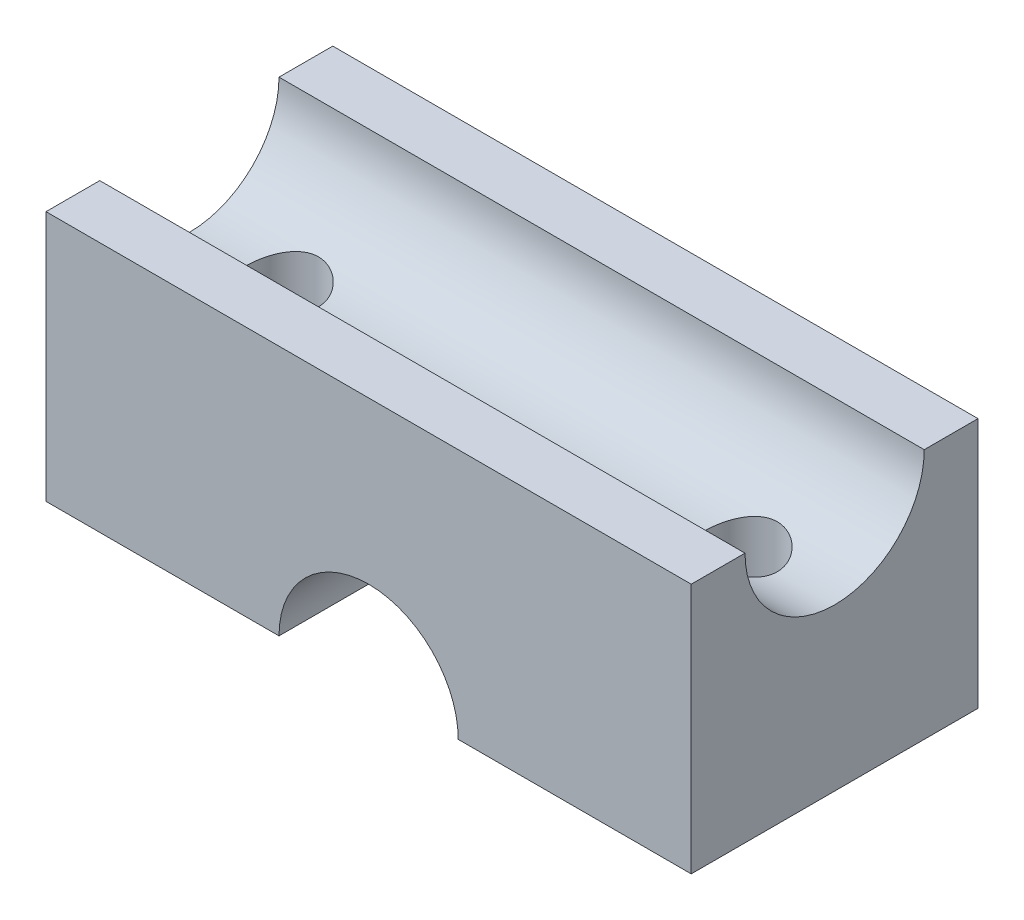
ISO-10303-21;
HEADER;
FILE_DESCRIPTION(('STEP AP214'),'2;1');
FILE_NAME('part.step','',(''),(''),'','','');
FILE_SCHEMA(('AUTOMOTIVE_DESIGN { 1 0 10303 214 1 1 1 1 }'));
ENDSEC;
DATA;
#1=APPLICATION_CONTEXT('core data for automotive mechanical design processes');
#2=APPLICATION_PROTOCOL_DEFINITION('international standard','automotive_design',2000,#1);
#3=PRODUCT_CONTEXT('',#1,'mechanical');
#4=PRODUCT('Part','Part','',(#3));
#5=PRODUCT_RELATED_PRODUCT_CATEGORY('part','',(#4));
#6=PRODUCT_DEFINITION_FORMATION('','',#4);
#7=PRODUCT_DEFINITION_CONTEXT('part definition',#1,'design');
#8=PRODUCT_DEFINITION('design','',#6,#7);
#9=PRODUCT_DEFINITION_SHAPE('','',#8);
#10=(LENGTH_UNIT() NAMED_UNIT(*) SI_UNIT(.MILLI.,.METRE.));
#11=(NAMED_UNIT(*) PLANE_ANGLE_UNIT() SI_UNIT($,.RADIAN.));
#12=(NAMED_UNIT(*) SI_UNIT($,.STERADIAN.) SOLID_ANGLE_UNIT());
#13=UNCERTAINTY_MEASURE_WITH_UNIT(LENGTH_MEASURE(1.E-05),#10,'distance_accuracy_value','');
#14=(GEOMETRIC_REPRESENTATION_CONTEXT(3) GLOBAL_UNCERTAINTY_ASSIGNED_CONTEXT((#13)) GLOBAL_UNIT_ASSIGNED_CONTEXT((#10,
#11,#12)) REPRESENTATION_CONTEXT('',''));
#15=CARTESIAN_POINT('',(0.,0.,0.));
#16=DIRECTION('',(0.,0.,1.));
#17=DIRECTION('',(1.,0.,0.));
#18=AXIS2_PLACEMENT_3D('',#15,#16,#17);
#19=CARTESIAN_POINT('',(45.,0.,20.));
#20=DIRECTION('',(0.,1.,0.));
#21=DIRECTION('',(0.,0.,1.));
#22=AXIS2_PLACEMENT_3D('',#19,#20,#21);
#23=PLANE('',#22);
#24=CARTESIAN_POINT('',(-32.,0.,0.));
#25=DIRECTION('',(0.,-1.,0.));
#26=DIRECTION('',(0.,0.,1.));
#27=AXIS2_PLACEMENT_3D('',#24,#25,#26);
#28=CIRCLE('',#27,5.);
#29=CARTESIAN_POINT('',(-32.,0.,5.));
#30=VERTEX_POINT('',#29);
#31=EDGE_CURVE('E177',#30,#30,#28,.T.);
#32=ORIENTED_EDGE('',*,*,#31,.F.);
#33=EDGE_LOOP('',(#32));
#34=FACE_BOUND('',#33,.T.);
#35=DIRECTION('',(0.,0.,1.));
#36=VECTOR('',#35,1.);
#37=CARTESIAN_POINT('',(-12.5,0.,-20.001));
#38=LINE('',#37,#36);
#39=CARTESIAN_POINT('',(-12.5,0.,20.));
#40=VERTEX_POINT('',#39);
#41=CARTESIAN_POINT('',(-12.5,0.,-20.));
#42=VERTEX_POINT('',#41);
#43=EDGE_CURVE('E53',#40,#42,#38,.F.);
#44=ORIENTED_EDGE('',*,*,#43,.F.);
#45=DIRECTION('',(-1.,0.,0.));
#46=VECTOR('',#45,1.);
#47=CARTESIAN_POINT('',(45.,0.,20.));
#48=LINE('',#47,#46);
#49=CARTESIAN_POINT('',(-45.,0.,20.));
#50=VERTEX_POINT('',#49);
#51=EDGE_CURVE('E50',#40,#50,#48,.T.);
#52=ORIENTED_EDGE('',*,*,#51,.T.);
#53=DIRECTION('',(0.,0.,-1.));
#54=VECTOR('',#53,1.);
#55=CARTESIAN_POINT('',(-45.,0.,20.));
#56=LINE('',#55,#54);
#57=CARTESIAN_POINT('',(-45.,0.,-20.));
#58=VERTEX_POINT('',#57);
#59=EDGE_CURVE('E140',#50,#58,#56,.T.);
#60=ORIENTED_EDGE('',*,*,#59,.T.);
#61=DIRECTION('',(-1.,0.,0.));
#62=VECTOR('',#61,1.);
#63=CARTESIAN_POINT('',(45.,0.,-20.));
#64=LINE('',#63,#62);
#65=EDGE_CURVE('E151',#42,#58,#64,.T.);
#66=ORIENTED_EDGE('',*,*,#65,.F.);
#67=EDGE_LOOP('',(#44,#52,#60,#66));
#68=FACE_BOUND('',#67,.T.);
#69=ADVANCED_FACE('F39',(#34,#68),#23,.F.);
#70=CARTESIAN_POINT('',(32.,0.,0.));
#71=DIRECTION('',(0.,-1.,0.));
#72=DIRECTION('',(0.,0.,-1.));
#73=AXIS2_PLACEMENT_3D('',#70,#71,#72);
#74=CIRCLE('',#73,5.);
#75=CARTESIAN_POINT('',(32.,0.,-5.));
#76=VERTEX_POINT('',#75);
#77=EDGE_CURVE('E181',#76,#76,#74,.T.);
#78=ORIENTED_EDGE('',*,*,#77,.F.);
#79=EDGE_LOOP('',(#78));
#80=FACE_BOUND('',#79,.T.);
#81=DIRECTION('',(0.,0.,1.));
#82=VECTOR('',#81,1.);
#83=CARTESIAN_POINT('',(12.5,0.,-20.001));
#84=LINE('',#83,#82);
#85=CARTESIAN_POINT('',(12.5,0.,-20.));
#86=VERTEX_POINT('',#85);
#87=CARTESIAN_POINT('',(12.5,0.,20.));
#88=VERTEX_POINT('',#87);
#89=EDGE_CURVE('E179',#86,#88,#84,.T.);
#90=ORIENTED_EDGE('',*,*,#89,.F.);
#91=CARTESIAN_POINT('',(45.,0.,-20.));
#92=VERTEX_POINT('',#91);
#93=EDGE_CURVE('E155',#92,#86,#64,.T.);
#94=ORIENTED_EDGE('',*,*,#93,.F.);
#95=DIRECTION('',(0.,0.,-1.));
#96=VECTOR('',#95,1.);
#97=CARTESIAN_POINT('',(45.,0.,20.));
#98=LINE('',#97,#96);
#99=CARTESIAN_POINT('',(45.,0.,20.));
#100=VERTEX_POINT('',#99);
#101=EDGE_CURVE('E98',#100,#92,#98,.T.);
#102=ORIENTED_EDGE('',*,*,#101,.F.);
#103=EDGE_CURVE('E11',#100,#88,#48,.T.);
#104=ORIENTED_EDGE('',*,*,#103,.T.);
#105=EDGE_LOOP('',(#90,#94,#102,#104));
#106=FACE_BOUND('',#105,.T.);
#107=ADVANCED_FACE('F217',(#80,#106),#23,.F.);
#108=CARTESIAN_POINT('',(45.,0.,20.));
#109=DIRECTION('',(0.,0.,-1.));
#110=DIRECTION('',(0.,1.,0.));
#111=AXIS2_PLACEMENT_3D('',#108,#109,#110);
#112=PLANE('',#111);
#113=CARTESIAN_POINT('',(0.,0.,20.));
#114=DIRECTION('',(0.,0.,1.));
#115=DIRECTION('',(1.,0.,0.));
#116=AXIS2_PLACEMENT_3D('',#113,#114,#115);
#117=CIRCLE('',#116,12.5);
#118=EDGE_CURVE('E174',#88,#40,#117,.T.);
#119=ORIENTED_EDGE('',*,*,#118,.F.);
#120=ORIENTED_EDGE('',*,*,#103,.F.);
#121=DIRECTION('',(0.,-1.,0.));
#122=VECTOR('',#121,1.);
#123=CARTESIAN_POINT('',(45.,0.,20.));
#124=LINE('',#123,#122);
#125=CARTESIAN_POINT('',(45.,35.,20.));
#126=VERTEX_POINT('',#125);
#127=EDGE_CURVE('E146',#126,#100,#124,.T.);
#128=ORIENTED_EDGE('',*,*,#127,.F.);
#129=DIRECTION('',(-1.,0.,0.));
#130=VECTOR('',#129,1.);
#131=CARTESIAN_POINT('',(45.,35.,20.));
#132=LINE('',#131,#130);
#133=CARTESIAN_POINT('',(-45.,35.,20.));
#134=VERTEX_POINT('',#133);
#135=EDGE_CURVE('E132',#126,#134,#132,.T.);
#136=ORIENTED_EDGE('',*,*,#135,.T.);
#137=DIRECTION('',(0.,-1.,0.));
#138=VECTOR('',#137,1.);
#139=CARTESIAN_POINT('',(-45.,0.,20.));
#140=LINE('',#139,#138);
#141=EDGE_CURVE('E133',#134,#50,#140,.T.);
#142=ORIENTED_EDGE('',*,*,#141,.T.);
#143=ORIENTED_EDGE('',*,*,#51,.F.);
#144=EDGE_LOOP('',(#119,#120,#128,#136,#142,#143));
#145=FACE_BOUND('',#144,.T.);
#146=ADVANCED_FACE('F41',(#145),#112,.F.);
#147=CARTESIAN_POINT('',(45.,0.,-20.));
#148=DIRECTION('',(0.,0.,1.));
#149=DIRECTION('',(0.,-1.,0.));
#150=AXIS2_PLACEMENT_3D('',#147,#148,#149);
#151=PLANE('',#150);
#152=CARTESIAN_POINT('',(0.,0.,-20.));
#153=DIRECTION('',(0.,0.,1.));
#154=DIRECTION('',(0.,-1.,0.));
#155=AXIS2_PLACEMENT_3D('',#152,#153,#154);
#156=CIRCLE('',#155,12.5);
#157=EDGE_CURVE('E138',#42,#86,#156,.F.);
#158=ORIENTED_EDGE('',*,*,#157,.F.);
#159=ORIENTED_EDGE('',*,*,#65,.T.);
#160=DIRECTION('',(0.,1.,0.));
#161=VECTOR('',#160,1.);
#162=CARTESIAN_POINT('',(-45.,0.,-20.));
#163=LINE('',#162,#161);
#164=CARTESIAN_POINT('',(-45.,35.,-20.));
#165=VERTEX_POINT('',#164);
#166=EDGE_CURVE('E142',#58,#165,#163,.T.);
#167=ORIENTED_EDGE('',*,*,#166,.T.);
#168=DIRECTION('',(-1.,0.,0.));
#169=VECTOR('',#168,1.);
#170=CARTESIAN_POINT('',(45.,35.,-20.));
#171=LINE('',#170,#169);
#172=CARTESIAN_POINT('',(45.,35.,-20.));
#173=VERTEX_POINT('',#172);
#174=EDGE_CURVE('E127',#173,#165,#171,.T.);
#175=ORIENTED_EDGE('',*,*,#174,.F.);
#176=DIRECTION('',(0.,1.,0.));
#177=VECTOR('',#176,1.);
#178=CARTESIAN_POINT('',(45.,0.,-20.));
#179=LINE('',#178,#177);
#180=EDGE_CURVE('E111',#92,#173,#179,.T.);
#181=ORIENTED_EDGE('',*,*,#180,.F.);
#182=ORIENTED_EDGE('',*,*,#93,.T.);
#183=EDGE_LOOP('',(#158,#159,#167,#175,#181,#182));
#184=FACE_BOUND('',#183,.T.);
#185=ADVANCED_FACE('F156',(#184),#151,.F.);
#186=CARTESIAN_POINT('',(45.,35.,-12.5));
#187=DIRECTION('',(0.,-1.,0.));
#188=DIRECTION('',(0.,0.,-1.));
#189=AXIS2_PLACEMENT_3D('',#186,#187,#188);
#190=PLANE('',#189);
#191=DIRECTION('',(0.,0.,1.));
#192=VECTOR('',#191,1.);
#193=CARTESIAN_POINT('',(-45.,35.,-12.5));
#194=LINE('',#193,#192);
#195=CARTESIAN_POINT('',(-45.,35.,-12.5));
#196=VERTEX_POINT('',#195);
#197=EDGE_CURVE('E125',#165,#196,#194,.T.);
#198=ORIENTED_EDGE('',*,*,#197,.T.);
#199=DIRECTION('',(-1.,0.,0.));
#200=VECTOR('',#199,1.);
#201=CARTESIAN_POINT('',(45.,35.,-12.5));
#202=LINE('',#201,#200);
#203=CARTESIAN_POINT('',(45.,35.,-12.5));
#204=VERTEX_POINT('',#203);
#205=EDGE_CURVE('E118',#204,#196,#202,.T.);
#206=ORIENTED_EDGE('',*,*,#205,.F.);
#207=DIRECTION('',(0.,0.,1.));
#208=VECTOR('',#207,1.);
#209=CARTESIAN_POINT('',(45.,35.,-12.5));
#210=LINE('',#209,#208);
#211=EDGE_CURVE('E110',#173,#204,#210,.T.);
#212=ORIENTED_EDGE('',*,*,#211,.F.);
#213=ORIENTED_EDGE('',*,*,#174,.T.);
#214=EDGE_LOOP('',(#198,#206,#212,#213));
#215=FACE_BOUND('',#214,.T.);
#216=ADVANCED_FACE('F124',(#215),#190,.F.);
#217=CARTESIAN_POINT('',(45.,35.,0.));
#218=DIRECTION('',(-1.,0.,0.));
#219=DIRECTION('',(0.,0.,1.));
#220=AXIS2_PLACEMENT_3D('',#217,#218,#219);
#221=CYLINDRICAL_SURFACE('',#220,12.5);
#222=CARTESIAN_POINT('',(32.,23.5435607626104,-4.99999999999999));
#223=CARTESIAN_POINT('',(31.8660283447571,23.5435597282972,-4.99999896345635));
#224=CARTESIAN_POINT('',(31.7320157412703,23.541202866164,-4.99460812226168));
#225=CARTESIAN_POINT('',(31.4649593159264,23.531851217671,-4.97309727860773));
#226=CARTESIAN_POINT('',(31.3319161374354,23.524853592646,-4.95697070928759));
#227=CARTESIAN_POINT('',(31.0675821130226,23.506437131682,-4.91411809632373));
#228=CARTESIAN_POINT('',(30.9362953014132,23.4950094861683,-4.88737092988402));
#229=CARTESIAN_POINT('',(30.6766328447658,23.4681046124875,-4.82354498839358));
#230=CARTESIAN_POINT('',(30.5482584323957,23.4526257031396,-4.78646192376798));
#231=CARTESIAN_POINT('',(30.2958467735072,23.418179074227,-4.70249631279828));
#232=CARTESIAN_POINT('',(30.1717935213556,23.3992263407905,-4.65565574627602));
#233=CARTESIAN_POINT('',(29.9281880184655,23.3583524434179,-4.55248500137673));
#234=CARTESIAN_POINT('',(29.8086374787532,23.3364301653167,-4.49615125924047));
#235=CARTESIAN_POINT('',(29.4579270960664,23.2671507036288,-4.3136049615171));
#236=CARTESIAN_POINT('',(29.2343936453876,23.2162354581091,-4.17374176623427));
#237=CARTESIAN_POINT('',(28.8018142111573,23.1074749754673,-3.85329894815133));
#238=CARTESIAN_POINT('',(28.5941207934567,23.0494072807794,-3.67098388496262));
#239=CARTESIAN_POINT('',(28.211165651799,22.9346833439582,-3.27423726141593));
#240=CARTESIAN_POINT('',(28.0359152613584,22.8780276010292,-3.05979452486022));
#241=CARTESIAN_POINT('',(27.7978552144935,22.797452502331,-2.71343446709669));
#242=CARTESIAN_POINT('',(27.7214339497963,22.7708662764241,-2.5912733099283));
#243=CARTESIAN_POINT('',(27.5792226804951,22.720388854284,-2.34040236484103));
#244=CARTESIAN_POINT('',(27.5134282949656,22.6964965487163,-2.21169530438851));
#245=CARTESIAN_POINT('',(27.3930458325952,22.6520894389729,-1.94856757348531));
#246=CARTESIAN_POINT('',(27.3384590864486,22.6315750359161,-1.81414622685607));
#247=CARTESIAN_POINT('',(27.2410603355298,22.5945384235569,-1.54063330241623));
#248=CARTESIAN_POINT('',(27.1982425867934,22.578014267259,-1.40154404015104));
#249=CARTESIAN_POINT('',(27.1265801700171,22.5501331285953,-1.12649748730775));
#250=CARTESIAN_POINT('',(27.0971633612554,22.5385661626969,-0.990710411787391));
#251=CARTESIAN_POINT('',(27.0497150885416,22.5198219350164,-0.716918272307652));
#252=CARTESIAN_POINT('',(27.0316786422134,22.5126427522854,-0.578914206131956));
#253=CARTESIAN_POINT('',(27.0071741086334,22.5028729720003,-0.301736395081969));
#254=CARTESIAN_POINT('',(27.000704705593,22.5002818525395,-0.162562785056849));
#255=CARTESIAN_POINT('',(26.9994044220967,22.4997617983353,0.115845101070381));
#256=CARTESIAN_POINT('',(27.004573132475,22.5018326996874,0.255079374867643));
#257=CARTESIAN_POINT('',(27.0258690983752,22.5103286287078,0.524650869352976));
#258=CARTESIAN_POINT('',(27.0413614909945,22.5165013532998,0.65504677297613));
#259=CARTESIAN_POINT('',(27.0825039320662,22.5327865490012,0.914018496973082));
#260=CARTESIAN_POINT('',(27.1081573562362,22.5429003293977,1.04259369775127));
#261=CARTESIAN_POINT('',(27.1693722183383,22.5668117819479,1.29697225214547));
#262=CARTESIAN_POINT('',(27.2049303985908,22.5806082428039,1.42277650247331));
#263=CARTESIAN_POINT('',(27.2856332827261,22.6115426140623,1.67086551320144));
#264=CARTESIAN_POINT('',(27.3307816274306,22.6286817932958,1.7931489168656));
#265=CARTESIAN_POINT('',(27.4815462448966,22.6850675674925,2.15709786014183));
#266=CARTESIAN_POINT('',(27.6016096016308,22.7289274053183,2.39225334748552));
#267=CARTESIAN_POINT('',(27.8761772077449,22.8246389547488,2.83956110178507));
#268=CARTESIAN_POINT('',(28.0306932614583,22.8764934036187,3.05170544744262));
#269=CARTESIAN_POINT('',(28.3816081565145,22.9869563954866,3.46190518931431));
#270=CARTESIAN_POINT('',(28.5800907527545,23.0457848558498,3.65812112197786));
#271=CARTESIAN_POINT('',(29.0075204226263,23.1609654593056,4.01529203734466));
#272=CARTESIAN_POINT('',(29.2364774284798,23.2173167870516,4.17623547858126));
#273=CARTESIAN_POINT('',(29.6019725905173,23.2959078698718,4.38978443246195));
#274=CARTESIAN_POINT('',(29.7294421756794,23.3214309007868,4.45706290689687));
#275=CARTESIAN_POINT('',(29.990188779216,23.3693100131468,4.58054965734117));
#276=CARTESIAN_POINT('',(30.1234634133913,23.3916673790243,4.63676242676806));
#277=CARTESIAN_POINT('',(30.3948711331214,23.4324400959905,4.73756451801146));
#278=CARTESIAN_POINT('',(30.5330026690723,23.4508566913382,4.78215750962756));
#279=CARTESIAN_POINT('',(30.813124013641,23.4830850501522,4.8592612872628));
#280=CARTESIAN_POINT('',(30.9551135106747,23.4968971843046,4.89177304591582));
#281=CARTESIAN_POINT('',(31.2330205622847,23.5186997901185,4.94271833591523));
#282=CARTESIAN_POINT('',(31.3687791615958,23.5269943556979,4.96189056112493));
#283=CARTESIAN_POINT('',(31.6416170735738,23.5387667072066,4.98902318531047));
#284=CARTESIAN_POINT('',(31.7786963074636,23.5422447786741,4.9969842489227));
#285=CARTESIAN_POINT('',(32.0530459962113,23.5442589658173,5.00160011831507));
#286=CARTESIAN_POINT('',(32.1903163932562,23.5427963440774,4.99825781264842));
#287=CARTESIAN_POINT('',(32.4639741829388,23.534985260619,4.9803144219869));
#288=CARTESIAN_POINT('',(32.6003615977501,23.5286369220757,4.96571362083305));
#289=CARTESIAN_POINT('',(32.8634312022493,23.5117762079951,4.9265749164465));
#290=CARTESIAN_POINT('',(32.9902220519028,23.5015229858773,4.90265366107081));
#291=CARTESIAN_POINT('',(33.2412438186927,23.4771946886017,4.8451953366982));
#292=CARTESIAN_POINT('',(33.3654738932115,23.4631183763996,4.81165515509086));
#293=CARTESIAN_POINT('',(33.7330822513964,23.4157545934881,4.69704010843111));
#294=CARTESIAN_POINT('',(33.9715824009333,23.3773182028339,4.60193998403524));
#295=CARTESIAN_POINT('',(34.4390467693337,23.2891533567317,4.37282827873934));
#296=CARTESIAN_POINT('',(34.6672320431578,23.2390301817487,4.23739510722871));
#297=CARTESIAN_POINT('',(35.0986908904228,23.1337425742253,3.93292512945836));
#298=CARTESIAN_POINT('',(35.3019542639372,23.0785760936003,3.76387463817205));
#299=CARTESIAN_POINT('',(35.6934608170582,22.9644698886347,3.38207030815392));
#300=CARTESIAN_POINT('',(35.8794855101171,22.9055524447724,3.16701066461656));
#301=CARTESIAN_POINT('',(36.1296007300178,22.8222565520902,2.8225211988967));
#302=CARTESIAN_POINT('',(36.2081897837919,22.7953236540126,2.70396535427571));
#303=CARTESIAN_POINT('',(36.3551743297635,22.7438667734304,2.46021851983988));
#304=CARTESIAN_POINT('',(36.4235742026212,22.7193417572543,2.33503041301595));
#305=CARTESIAN_POINT('',(36.549625993472,22.6733763579408,2.07877500253335));
#306=CARTESIAN_POINT('',(36.6072751087603,22.6519367795036,1.94770617679832));
#307=CARTESIAN_POINT('',(36.7112484341921,22.6127669614713,1.68067073132675));
#308=CARTESIAN_POINT('',(36.7575774622826,22.5950351442793,1.5447062236131));
#309=CARTESIAN_POINT('',(36.8384514406103,22.5637939747987,1.26887322258795));
#310=CARTESIAN_POINT('',(36.8729990967598,22.5502836529886,1.12900563371975));
#311=CARTESIAN_POINT('',(36.9299369384677,22.5278874632576,0.846455094767155));
#312=CARTESIAN_POINT('',(36.9523279459485,22.5190012826958,0.703772335695227));
#313=CARTESIAN_POINT('',(36.9836307849264,22.5065462788594,0.426189188874798));
#314=CARTESIAN_POINT('',(36.9933290978161,22.5026674271553,0.291390847308921));
#315=CARTESIAN_POINT('',(37.0017794297219,22.4992887598456,0.0213478994604192));
#316=CARTESIAN_POINT('',(37.0005277609661,22.4997904195234,-0.113896841832118));
#317=CARTESIAN_POINT('',(36.9870853137872,22.505161772332,-0.383682371685984));
#318=CARTESIAN_POINT('',(36.9749002097683,22.5100291996485,-0.518223488997534));
#319=CARTESIAN_POINT('',(36.9397231134616,22.5239988456623,-0.785710697483681));
#320=CARTESIAN_POINT('',(36.9167270918159,22.5331026432925,-0.918656174981795));
#321=CARTESIAN_POINT('',(36.8610407550843,22.5549575790971,-1.17783467109344));
#322=CARTESIAN_POINT('',(36.8286748940186,22.5675862071708,-1.30414775975408));
#323=CARTESIAN_POINT('',(36.7543161133706,22.5962764793008,-1.55352320958305));
#324=CARTESIAN_POINT('',(36.7123198178389,22.6123393270891,-1.6765844138923));
#325=CARTESIAN_POINT('',(36.5724070907497,22.6651163167564,-2.03966746176945));
#326=CARTESIAN_POINT('',(36.4605203244963,22.7064379121275,-2.27380285420271));
#327=CARTESIAN_POINT('',(36.1972279703312,22.7995509357034,-2.73054850188529));
#328=CARTESIAN_POINT('',(36.0442945231078,22.8517243371587,-2.95219224097235));
#329=CARTESIAN_POINT('',(35.7055434478446,22.9602623389043,-3.36761879060515));
#330=CARTESIAN_POINT('',(35.5197122091607,23.0166286682962,-3.56139000921306));
#331=CARTESIAN_POINT('',(35.1066642056903,23.131563376681,-3.92802886630618));
#332=CARTESIAN_POINT('',(34.8775976026115,23.1900520609289,-4.09885985592737));
#333=CARTESIAN_POINT('',(34.5138807539211,23.271591549469,-4.324448364638));
#334=CARTESIAN_POINT('',(34.3892009253691,23.297754188566,-4.39457064715658));
#335=CARTESIAN_POINT('',(34.1338529587129,23.347203177975,-4.52406061529862));
#336=CARTESIAN_POINT('',(34.0031877807881,23.3704909295079,-4.58343354679448));
#337=CARTESIAN_POINT('',(33.7486504961309,23.4114955099437,-4.68607952471921));
#338=CARTESIAN_POINT('',(33.6252161622397,23.4295243188762,-4.73031761912948));
#339=CARTESIAN_POINT('',(33.3748702113205,23.4620244513149,-4.80904723188734));
#340=CARTESIAN_POINT('',(33.2479601996582,23.476497387424,-4.84354316940792));
#341=CARTESIAN_POINT('',(32.9917302139116,23.5014216232798,-4.90241942653942));
#342=CARTESIAN_POINT('',(32.8624162471613,23.5118818219718,-4.92682213915176));
#343=CARTESIAN_POINT('',(32.6020463003409,23.5284872895019,-4.96536414411406));
#344=CARTESIAN_POINT('',(32.4709913764836,23.5346350628106,-4.9795093937172));
#345=CARTESIAN_POINT('',(32.2830623031111,23.5402038943261,-4.99230265232102));
#346=CARTESIAN_POINT('',(32.2265003704817,23.5414617102461,-4.99518816672681));
#347=CARTESIAN_POINT('',(32.1132947363357,23.5431403937546,-4.9990371301843));
#348=CARTESIAN_POINT('',(32.0566510291284,23.5435611999783,-5.0000004383111));
#349=CARTESIAN_POINT('',(32.,23.5435607626104,-4.99999999999999));
#350=B_SPLINE_CURVE_WITH_KNOTS('',3,(#222,#223,#224,#225,#226,#227,#228,#229,#230,#231,#232,
#233,#234,#235,#236,#237,#238,#239,#240,#241,#242,#243,#244,#245,#246,#247,#248,#249,#250,#251,
#252,#253,#254,#255,#256,#257,#258,#259,#260,#261,#262,#263,#264,#265,#266,#267,#268,#269,#270,
#271,#272,#273,#274,#275,#276,#277,#278,#279,#280,#281,#282,#283,#284,#285,#286,#287,#288,#289,
#290,#291,#292,#293,#294,#295,#296,#297,#298,#299,#300,#301,#302,#303,#304,#305,#306,#307,#308,
#309,#310,#311,#312,#313,#314,#315,#316,#317,#318,#319,#320,#321,#322,#323,#324,#325,#326,#327,
#328,#329,#330,#331,#332,#333,#334,#335,#336,#337,#338,#339,#340,#341,#342,#343,#344,#345,#346,
#347,#348,#349),.UNSPECIFIED.,.T.,.F.,(4,2,2,2,2,2,2,2,2,2,2,2,2,2,2,2,2,2,2,2,2,2,2,2,2,2,2,2,
2,2,2,2,2,2,2,2,2,2,2,2,2,2,2,2,2,2,2,2,2,2,2,2,2,2,2,2,2,2,2,2,2,2,2,4),(0.,0.401857604173006,
0.80396124388899,1.20686864636058,1.60994351192958,2.01131877198553,2.41284504624413,
3.21490370860719,4.05855844512127,4.90250734671921,5.34162944437914,5.78057004956793,
6.21956274051596,6.65834079517783,7.07605372410076,7.49358364921535,7.91106607592916,
8.3285338252766,8.7224433905093,9.11648393105506,9.51039502417149,9.90445593031429,
10.7036345579603,11.5030874255886,12.3550281541217,13.207247230266,13.6459081564649,
14.0843905878331,14.5227343678116,14.9610428500329,15.3725755678593,15.7840838875773,
16.1954870551217,16.6068798510072,16.9947241755283,17.3826941453684,18.1580219095308,
18.9647918095573,19.771890806386,20.6386062994143,21.0724736227438,21.5061538706741,
21.9399470207648,22.3735552211117,22.8070637643666,23.2405429940499,23.6456433748876,
24.050880192055,24.4559068146868,24.8610845153934,25.2536349873096,25.646323278747,
26.4310478633778,27.2504496961613,28.0701913317683,28.9406797498035,29.3764938523357,
29.8120946932276,30.2087331024766,30.6051913011724,31.0007651307086,31.3961090374152,
31.566025412174,31.735954243748),.UNSPECIFIED.);
#351=CARTESIAN_POINT('',(32.,23.5435607626104,-4.99999999999999));
#352=VERTEX_POINT('',#351);
#353=EDGE_CURVE('E178',#352,#352,#350,.T.);
#354=ORIENTED_EDGE('',*,*,#353,.F.);
#355=EDGE_LOOP('',(#354));
#356=FACE_BOUND('',#355,.T.);
#357=CARTESIAN_POINT('',(-32.,23.5435607626104,-4.99999999999999));
#358=CARTESIAN_POINT('',(-32.1339716552429,23.5435597282972,-4.99999896345635));
#359=CARTESIAN_POINT('',(-32.2679842587297,23.541202866164,-4.99460812226168));
#360=CARTESIAN_POINT('',(-32.5350406840736,23.531851217671,-4.97309727860773));
#361=CARTESIAN_POINT('',(-32.6680838625646,23.524853592646,-4.95697070928759));
#362=CARTESIAN_POINT('',(-32.9324178869774,23.5064371316819,-4.91411809632373));
#363=CARTESIAN_POINT('',(-33.0637046985868,23.4950094861683,-4.88737092988402));
#364=CARTESIAN_POINT('',(-33.3233671552342,23.4681046124875,-4.82354498839358));
#365=CARTESIAN_POINT('',(-33.4517415676043,23.4526257031396,-4.78646192376798));
#366=CARTESIAN_POINT('',(-33.7041532264928,23.418179074227,-4.70249631279829));
#367=CARTESIAN_POINT('',(-33.8282064786444,23.3992263407905,-4.65565574627602));
#368=CARTESIAN_POINT('',(-34.0718119815345,23.3583524434179,-4.55248500137673));
#369=CARTESIAN_POINT('',(-34.1913625212468,23.3364301653167,-4.49615125924048));
#370=CARTESIAN_POINT('',(-34.5420729039336,23.2671507036288,-4.31360496151711));
#371=CARTESIAN_POINT('',(-34.7656063546124,23.2162354581091,-4.17374176623427));
#372=CARTESIAN_POINT('',(-35.1981857888427,23.1074749754673,-3.85329894815134));
#373=CARTESIAN_POINT('',(-35.4058792065432,23.0494072807794,-3.67098388496263));
#374=CARTESIAN_POINT('',(-35.788834348201,22.9346833439582,-3.27423726141594));
#375=CARTESIAN_POINT('',(-35.9640847386416,22.8780276010292,-3.05979452486023));
#376=CARTESIAN_POINT('',(-36.2021447855065,22.797452502331,-2.71343446709669));
#377=CARTESIAN_POINT('',(-36.2785660502037,22.7708662764241,-2.59127330992831));
#378=CARTESIAN_POINT('',(-36.4207773195049,22.720388854284,-2.34040236484104));
#379=CARTESIAN_POINT('',(-36.4865717050344,22.6964965487163,-2.21169530438852));
#380=CARTESIAN_POINT('',(-36.6069541674047,22.6520894389729,-1.94856757348532));
#381=CARTESIAN_POINT('',(-36.6615409135514,22.6315750359161,-1.81414622685608));
#382=CARTESIAN_POINT('',(-36.7589396644702,22.5945384235569,-1.54063330241623));
#383=CARTESIAN_POINT('',(-36.8017574132066,22.578014267259,-1.40154404015105));
#384=CARTESIAN_POINT('',(-36.8734198299829,22.5501331285953,-1.12649748730776));
#385=CARTESIAN_POINT('',(-36.9028366387446,22.5385661626969,-0.990710411787403));
#386=CARTESIAN_POINT('',(-36.9502849114584,22.5198219350164,-0.716918272307663));
#387=CARTESIAN_POINT('',(-36.9683213577866,22.5126427522854,-0.578914206131967));
#388=CARTESIAN_POINT('',(-36.9928258913666,22.5028729720003,-0.30173639508198));
#389=CARTESIAN_POINT('',(-36.999295294407,22.5002818525395,-0.16256278505686));
#390=CARTESIAN_POINT('',(-37.0005955779033,22.4997617983353,0.115845101070369));
#391=CARTESIAN_POINT('',(-36.995426867525,22.5018326996874,0.255079374867631));
#392=CARTESIAN_POINT('',(-36.9741309016248,22.5103286287078,0.524650869352965));
#393=CARTESIAN_POINT('',(-36.9586385090055,22.5165013532998,0.65504677297612));
#394=CARTESIAN_POINT('',(-36.9174960679338,22.5327865490012,0.914018496973072));
#395=CARTESIAN_POINT('',(-36.8918426437638,22.5429003293977,1.04259369775126));
#396=CARTESIAN_POINT('',(-36.8306277816617,22.5668117819479,1.29697225214546));
#397=CARTESIAN_POINT('',(-36.7950696014092,22.5806082428039,1.4227765024733));
#398=CARTESIAN_POINT('',(-36.7143667172739,22.6115426140623,1.67086551320143));
#399=CARTESIAN_POINT('',(-36.6692183725694,22.6286817932958,1.79314891686559));
#400=CARTESIAN_POINT('',(-36.5184537551035,22.6850675674925,2.15709786014183));
#401=CARTESIAN_POINT('',(-36.3983903983692,22.7289274053183,2.39225334748551));
#402=CARTESIAN_POINT('',(-36.1238227922551,22.8246389547488,2.83956110178506));
#403=CARTESIAN_POINT('',(-35.9693067385417,22.8764934036187,3.05170544744261));
#404=CARTESIAN_POINT('',(-35.6183918434855,22.9869563954866,3.4619051893143));
#405=CARTESIAN_POINT('',(-35.4199092472455,23.0457848558498,3.65812112197785));
#406=CARTESIAN_POINT('',(-34.9924795773737,23.1609654593056,4.01529203734465));
#407=CARTESIAN_POINT('',(-34.7635225715202,23.2173167870516,4.17623547858125));
#408=CARTESIAN_POINT('',(-34.3980274094827,23.2959078698718,4.38978443246195));
#409=CARTESIAN_POINT('',(-34.2705578243206,23.3214309007868,4.45706290689687));
#410=CARTESIAN_POINT('',(-34.009811220784,23.3693100131468,4.58054965734117));
#411=CARTESIAN_POINT('',(-33.8765365866087,23.3916673790243,4.63676242676806));
#412=CARTESIAN_POINT('',(-33.6051288668786,23.4324400959905,4.73756451801146));
#413=CARTESIAN_POINT('',(-33.4669973309277,23.4508566913382,4.78215750962756));
#414=CARTESIAN_POINT('',(-33.186875986359,23.4830850501522,4.8592612872628));
#415=CARTESIAN_POINT('',(-33.0448864893253,23.4968971843046,4.89177304591582));
#416=CARTESIAN_POINT('',(-32.7669794377153,23.5186997901185,4.94271833591523));
#417=CARTESIAN_POINT('',(-32.6312208384042,23.5269943556979,4.96189056112493));
#418=CARTESIAN_POINT('',(-32.3583829264263,23.5387667072066,4.98902318531047));
#419=CARTESIAN_POINT('',(-32.2213036925364,23.5422447786741,4.9969842489227));
#420=CARTESIAN_POINT('',(-31.9469540037887,23.5442589658173,5.00160011831507));
#421=CARTESIAN_POINT('',(-31.8096836067438,23.5427963440774,4.99825781264842));
#422=CARTESIAN_POINT('',(-31.5360258170613,23.534985260619,4.9803144219869));
#423=CARTESIAN_POINT('',(-31.3996384022499,23.5286369220757,4.96571362083305));
#424=CARTESIAN_POINT('',(-31.1365687977507,23.5117762079951,4.9265749164465));
#425=CARTESIAN_POINT('',(-31.0097779480972,23.5015229858773,4.90265366107081));
#426=CARTESIAN_POINT('',(-30.7587561813074,23.4771946886017,4.8451953366982));
#427=CARTESIAN_POINT('',(-30.6345261067885,23.4631183763996,4.81165515509086));
#428=CARTESIAN_POINT('',(-30.2669177486036,23.4157545934881,4.69704010843111));
#429=CARTESIAN_POINT('',(-30.0284175990668,23.3773182028339,4.60193998403524));
#430=CARTESIAN_POINT('',(-29.5609532306664,23.2891533567317,4.37282827873935));
#431=CARTESIAN_POINT('',(-29.3327679568423,23.2390301817487,4.23739510722872));
#432=CARTESIAN_POINT('',(-28.9013091095773,23.1337425742253,3.93292512945837));
#433=CARTESIAN_POINT('',(-28.6980457360628,23.0785760936003,3.76387463817206));
#434=CARTESIAN_POINT('',(-28.3065391829418,22.9644698886347,3.38207030815393));
#435=CARTESIAN_POINT('',(-28.1205144898829,22.9055524447724,3.16701066461657));
#436=CARTESIAN_POINT('',(-27.8703992699822,22.8222565520902,2.8225211988967));
#437=CARTESIAN_POINT('',(-27.7918102162081,22.7953236540126,2.70396535427571));
#438=CARTESIAN_POINT('',(-27.6448256702365,22.7438667734304,2.46021851983988));
#439=CARTESIAN_POINT('',(-27.5764257973788,22.7193417572543,2.33503041301595));
#440=CARTESIAN_POINT('',(-27.450374006528,22.6733763579408,2.07877500253335));
#441=CARTESIAN_POINT('',(-27.3927248912397,22.6519367795036,1.94770617679833));
#442=CARTESIAN_POINT('',(-27.2887515658079,22.6127669614713,1.68067073132675));
#443=CARTESIAN_POINT('',(-27.2424225377174,22.5950351442793,1.54470622361311));
#444=CARTESIAN_POINT('',(-27.1615485593897,22.5637939747987,1.26887322258795));
#445=CARTESIAN_POINT('',(-27.1270009032402,22.5502836529886,1.12900563371975));
#446=CARTESIAN_POINT('',(-27.0700630615323,22.5278874632576,0.846455094767157));
#447=CARTESIAN_POINT('',(-27.0476720540515,22.5190012826958,0.70377233569523));
#448=CARTESIAN_POINT('',(-27.0163692150736,22.5065462788594,0.426189188874801));
#449=CARTESIAN_POINT('',(-27.0066709021839,22.5026674271553,0.291390847308924));
#450=CARTESIAN_POINT('',(-26.9982205702781,22.4992887598456,0.0213478994604242));
#451=CARTESIAN_POINT('',(-26.9994722390339,22.4997904195234,-0.113896841832111));
#452=CARTESIAN_POINT('',(-27.0129146862128,22.505161772332,-0.383682371685977));
#453=CARTESIAN_POINT('',(-27.0250997902317,22.5100291996485,-0.518223488997527));
#454=CARTESIAN_POINT('',(-27.0602768865384,22.5239988456623,-0.785710697483674));
#455=CARTESIAN_POINT('',(-27.0832729081841,22.5331026432925,-0.918656174981787));
#456=CARTESIAN_POINT('',(-27.1389592449157,22.5549575790971,-1.17783467109343));
#457=CARTESIAN_POINT('',(-27.1713251059814,22.5675862071708,-1.30414775975407));
#458=CARTESIAN_POINT('',(-27.2456838866294,22.5962764793008,-1.55352320958304));
#459=CARTESIAN_POINT('',(-27.2876801821611,22.6123393270891,-1.67658441389229));
#460=CARTESIAN_POINT('',(-27.4275929092503,22.6651163167564,-2.03966746176944));
#461=CARTESIAN_POINT('',(-27.5394796755037,22.7064379121275,-2.27380285420271));
#462=CARTESIAN_POINT('',(-27.8027720296687,22.7995509357034,-2.73054850188528));
#463=CARTESIAN_POINT('',(-27.9557054768922,22.8517243371587,-2.95219224097234));
#464=CARTESIAN_POINT('',(-28.2944565521554,22.9602623389043,-3.36761879060514));
#465=CARTESIAN_POINT('',(-28.4802877908393,23.0166286682962,-3.56139000921305));
#466=CARTESIAN_POINT('',(-28.8933357943097,23.131563376681,-3.92802886630617));
#467=CARTESIAN_POINT('',(-29.1224023973885,23.1900520609289,-4.09885985592736));
#468=CARTESIAN_POINT('',(-29.4861192460789,23.271591549469,-4.32444836463799));
#469=CARTESIAN_POINT('',(-29.6107990746309,23.297754188566,-4.39457064715658));
#470=CARTESIAN_POINT('',(-29.8661470412871,23.347203177975,-4.52406061529861));
#471=CARTESIAN_POINT('',(-29.9968122192119,23.3704909295079,-4.58343354679448));
#472=CARTESIAN_POINT('',(-30.2513495038691,23.4114955099437,-4.68607952471921));
#473=CARTESIAN_POINT('',(-30.3747838377603,23.4295243188762,-4.73031761912948));
#474=CARTESIAN_POINT('',(-30.6251297886795,23.4620244513149,-4.80904723188734));
#475=CARTESIAN_POINT('',(-30.7520398003418,23.476497387424,-4.84354316940792));
#476=CARTESIAN_POINT('',(-31.0082697860884,23.5014216232798,-4.90241942653942));
#477=CARTESIAN_POINT('',(-31.1375837528387,23.5118818219718,-4.92682213915176));
#478=CARTESIAN_POINT('',(-31.3979536996591,23.5284872895019,-4.96536414411406));
#479=CARTESIAN_POINT('',(-31.5290086235164,23.5346350628106,-4.9795093937172));
#480=CARTESIAN_POINT('',(-31.7169376968889,23.5402038943261,-4.99230265232102));
#481=CARTESIAN_POINT('',(-31.7734996295183,23.5414617102461,-4.99518816672681));
#482=CARTESIAN_POINT('',(-31.8867052636643,23.5431403937546,-4.9990371301843));
#483=CARTESIAN_POINT('',(-31.9433489708716,23.5435611999783,-5.0000004383111));
#484=CARTESIAN_POINT('',(-32.,23.5435607626104,-4.99999999999999));
#485=B_SPLINE_CURVE_WITH_KNOTS('',3,(#357,#358,#359,#360,#361,#362,#363,#364,#365,#366,#367,
#368,#369,#370,#371,#372,#373,#374,#375,#376,#377,#378,#379,#380,#381,#382,#383,#384,#385,#386,
#387,#388,#389,#390,#391,#392,#393,#394,#395,#396,#397,#398,#399,#400,#401,#402,#403,#404,#405,
#406,#407,#408,#409,#410,#411,#412,#413,#414,#415,#416,#417,#418,#419,#420,#421,#422,#423,#424,
#425,#426,#427,#428,#429,#430,#431,#432,#433,#434,#435,#436,#437,#438,#439,#440,#441,#442,#443,
#444,#445,#446,#447,#448,#449,#450,#451,#452,#453,#454,#455,#456,#457,#458,#459,#460,#461,#462,
#463,#464,#465,#466,#467,#468,#469,#470,#471,#472,#473,#474,#475,#476,#477,#478,#479,#480,#481,
#482,#483,#484),.UNSPECIFIED.,.T.,.F.,(4,2,2,2,2,2,2,2,2,2,2,2,2,2,2,2,2,2,2,2,2,2,2,2,2,2,2,2,
2,2,2,2,2,2,2,2,2,2,2,2,2,2,2,2,2,2,2,2,2,2,2,2,2,2,2,2,2,2,2,2,2,2,2,4),(0.,0.401857604173006,
0.803961243888993,1.20686864636058,1.60994351192957,2.01131877198553,2.41284504624413,
3.21490370860718,4.05855844512126,4.9025073467192,5.34162944437913,5.78057004956792,
6.21956274051594,6.65834079517782,7.07605372410075,7.49358364921534,7.91106607592915,
8.32853382527659,8.72244339050929,9.11648393105505,9.51039502417148,9.90445593031428,
10.7036345579602,11.5030874255886,12.3550281541217,13.207247230266,13.6459081564649,
14.0843905878331,14.5227343678116,14.9610428500329,15.3725755678593,15.7840838875773,
16.1954870551217,16.6068798510072,16.9947241755283,17.3826941453684,18.1580219095308,
18.9647918095573,19.771890806386,20.6386062994143,21.0724736227438,21.5061538706741,
21.9399470207648,22.3735552211117,22.8070637643667,23.2405429940499,23.6456433748876,
24.050880192055,24.4559068146868,24.8610845153933,25.2536349873096,25.646323278747,
26.4310478633778,27.2504496961613,28.0701913317683,28.9406797498035,29.3764938523357,
29.8120946932276,30.2087331024766,30.6051913011724,31.0007651307086,31.3961090374152,
31.566025412174,31.735954243748),.UNSPECIFIED.);
#486=CARTESIAN_POINT('',(-32.,23.5435607626104,-4.99999999999999));
#487=VERTEX_POINT('',#486);
#488=EDGE_CURVE('E184',#487,#487,#485,.T.);
#489=ORIENTED_EDGE('',*,*,#488,.F.);
#490=EDGE_LOOP('',(#489));
#491=FACE_BOUND('',#490,.T.);
#492=CARTESIAN_POINT('',(-45.,35.,0.));
#493=DIRECTION('',(-1.,0.,0.));
#494=DIRECTION('',(0.,0.,-1.));
#495=AXIS2_PLACEMENT_3D('',#492,#493,#494);
#496=CIRCLE('',#495,12.5);
#497=CARTESIAN_POINT('',(-45.,35.,12.5));
#498=VERTEX_POINT('',#497);
#499=EDGE_CURVE('E144',#196,#498,#496,.T.);
#500=ORIENTED_EDGE('',*,*,#499,.T.);
#501=DIRECTION('',(-1.,0.,0.));
#502=VECTOR('',#501,1.);
#503=CARTESIAN_POINT('',(45.,35.,12.5));
#504=LINE('',#503,#502);
#505=CARTESIAN_POINT('',(45.,35.,12.5));
#506=VERTEX_POINT('',#505);
#507=EDGE_CURVE('E130',#506,#498,#504,.T.);
#508=ORIENTED_EDGE('',*,*,#507,.F.);
#509=CARTESIAN_POINT('',(45.,35.,0.));
#510=DIRECTION('',(-1.,0.,0.));
#511=DIRECTION('',(0.,0.,-1.));
#512=AXIS2_PLACEMENT_3D('',#509,#510,#511);
#513=CIRCLE('',#512,12.5);
#514=EDGE_CURVE('E112',#204,#506,#513,.T.);
#515=ORIENTED_EDGE('',*,*,#514,.F.);
#516=ORIENTED_EDGE('',*,*,#205,.T.);
#517=EDGE_LOOP('',(#500,#508,#515,#516));
#518=FACE_BOUND('',#517,.T.);
#519=ADVANCED_FACE('F129',(#356,#491,#518),#221,.F.);
#520=CARTESIAN_POINT('',(45.,35.,20.));
#521=DIRECTION('',(0.,-1.,0.));
#522=DIRECTION('',(0.,0.,-1.));
#523=AXIS2_PLACEMENT_3D('',#520,#521,#522);
#524=PLANE('',#523);
#525=DIRECTION('',(0.,0.,1.));
#526=VECTOR('',#525,1.);
#527=CARTESIAN_POINT('',(-45.,35.,20.));
#528=LINE('',#527,#526);
#529=EDGE_CURVE('E89',#498,#134,#528,.T.);
#530=ORIENTED_EDGE('',*,*,#529,.T.);
#531=ORIENTED_EDGE('',*,*,#135,.F.);
#532=DIRECTION('',(0.,0.,1.));
#533=VECTOR('',#532,1.);
#534=CARTESIAN_POINT('',(45.,35.,20.));
#535=LINE('',#534,#533);
#536=EDGE_CURVE('E64',#506,#126,#535,.T.);
#537=ORIENTED_EDGE('',*,*,#536,.F.);
#538=ORIENTED_EDGE('',*,*,#507,.T.);
#539=EDGE_LOOP('',(#530,#531,#537,#538));
#540=FACE_BOUND('',#539,.T.);
#541=ADVANCED_FACE('F163',(#540),#524,.F.);
#542=CARTESIAN_POINT('',(45.,35.,0.));
#543=DIRECTION('',(1.,0.,0.));
#544=DIRECTION('',(0.,0.,-1.));
#545=AXIS2_PLACEMENT_3D('',#542,#543,#544);
#546=PLANE('',#545);
#547=ORIENTED_EDGE('',*,*,#127,.T.);
#548=ORIENTED_EDGE('',*,*,#101,.T.);
#549=ORIENTED_EDGE('',*,*,#180,.T.);
#550=ORIENTED_EDGE('',*,*,#211,.T.);
#551=ORIENTED_EDGE('',*,*,#514,.T.);
#552=ORIENTED_EDGE('',*,*,#536,.T.);
#553=EDGE_LOOP('',(#547,#548,#549,#550,#551,#552));
#554=FACE_BOUND('',#553,.T.);
#555=ADVANCED_FACE('F108',(#554),#546,.T.);
#556=CARTESIAN_POINT('',(-45.,35.,0.));
#557=DIRECTION('',(1.,0.,0.));
#558=DIRECTION('',(0.,0.,-1.));
#559=AXIS2_PLACEMENT_3D('',#556,#557,#558);
#560=PLANE('',#559);
#561=ORIENTED_EDGE('',*,*,#141,.F.);
#562=ORIENTED_EDGE('',*,*,#529,.F.);
#563=ORIENTED_EDGE('',*,*,#499,.F.);
#564=ORIENTED_EDGE('',*,*,#197,.F.);
#565=ORIENTED_EDGE('',*,*,#166,.F.);
#566=ORIENTED_EDGE('',*,*,#59,.F.);
#567=EDGE_LOOP('',(#561,#562,#563,#564,#565,#566));
#568=FACE_BOUND('',#567,.T.);
#569=ADVANCED_FACE('F162',(#568),#560,.F.);
#570=CARTESIAN_POINT('',(0.,0.,-20.001));
#571=DIRECTION('',(0.,0.,1.));
#572=DIRECTION('',(1.,0.,0.));
#573=AXIS2_PLACEMENT_3D('',#570,#571,#572);
#574=CYLINDRICAL_SURFACE('',#573,12.5);
#575=ORIENTED_EDGE('',*,*,#43,.T.);
#576=ORIENTED_EDGE('',*,*,#157,.T.);
#577=ORIENTED_EDGE('',*,*,#89,.T.);
#578=ORIENTED_EDGE('',*,*,#118,.T.);
#579=EDGE_LOOP('',(#575,#576,#577,#578));
#580=FACE_BOUND('',#579,.T.);
#581=ADVANCED_FACE('F205',(#580),#574,.F.);
#582=CARTESIAN_POINT('',(-32.,35.001,0.));
#583=DIRECTION('',(0.,-1.,0.));
#584=DIRECTION('',(0.,0.,-1.));
#585=AXIS2_PLACEMENT_3D('',#582,#583,#584);
#586=CYLINDRICAL_SURFACE('',#585,5.);
#587=ORIENTED_EDGE('',*,*,#31,.T.);
#588=EDGE_LOOP('',(#587));
#589=FACE_BOUND('',#588,.T.);
#590=ORIENTED_EDGE('',*,*,#488,.T.);
#591=EDGE_LOOP('',(#590));
#592=FACE_BOUND('',#591,.T.);
#593=ADVANCED_FACE('F196',(#589,#592),#586,.F.);
#594=CARTESIAN_POINT('',(32.,35.001,0.));
#595=DIRECTION('',(0.,-1.,0.));
#596=DIRECTION('',(0.,0.,-1.));
#597=AXIS2_PLACEMENT_3D('',#594,#595,#596);
#598=CYLINDRICAL_SURFACE('',#597,5.);
#599=ORIENTED_EDGE('',*,*,#77,.T.);
#600=EDGE_LOOP('',(#599));
#601=FACE_BOUND('',#600,.T.);
#602=ORIENTED_EDGE('',*,*,#353,.T.);
#603=EDGE_LOOP('',(#602));
#604=FACE_BOUND('',#603,.T.);
#605=ADVANCED_FACE('F229',(#601,#604),#598,.F.);
#606=CLOSED_SHELL('',(#69,#107,#146,#185,#216,#519,#541,#555,#569,#581,#593,#605));
#607=MANIFOLD_SOLID_BREP('B2',#606);
#608=ADVANCED_BREP_SHAPE_REPRESENTATION('',(#18,#607),#14);
#609=SHAPE_DEFINITION_REPRESENTATION(#9,#608);
ENDSEC;
END-ISO-10303-21;
